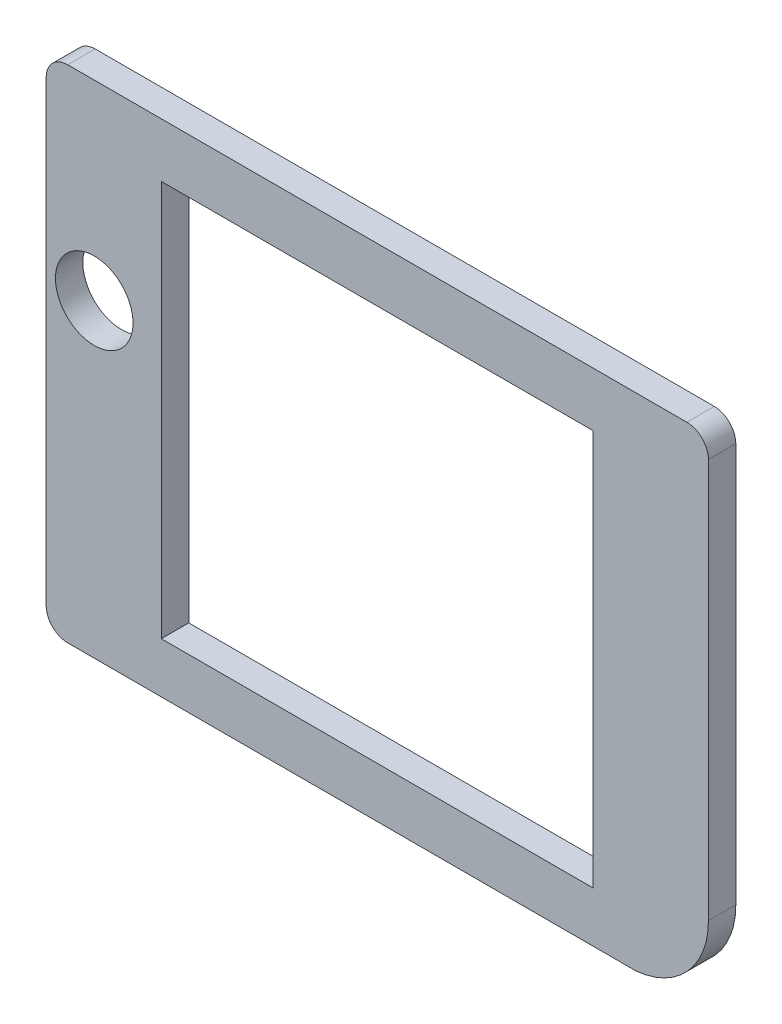
ISO-10303-21;
HEADER;
FILE_DESCRIPTION(('STEP AP214'),'2;1');
FILE_NAME('part.step','',(''),(''),'','','');
FILE_SCHEMA(('AUTOMOTIVE_DESIGN { 1 0 10303 214 1 1 1 1 }'));
ENDSEC;
DATA;
#1=APPLICATION_CONTEXT('core data for automotive mechanical design processes');
#2=APPLICATION_PROTOCOL_DEFINITION('international standard','automotive_design',2000,#1);
#3=PRODUCT_CONTEXT('',#1,'mechanical');
#4=PRODUCT('Part','Part','',(#3));
#5=PRODUCT_RELATED_PRODUCT_CATEGORY('part','',(#4));
#6=PRODUCT_DEFINITION_FORMATION('','',#4);
#7=PRODUCT_DEFINITION_CONTEXT('part definition',#1,'design');
#8=PRODUCT_DEFINITION('design','',#6,#7);
#9=PRODUCT_DEFINITION_SHAPE('','',#8);
#10=(LENGTH_UNIT() NAMED_UNIT(*) SI_UNIT(.MILLI.,.METRE.));
#11=(NAMED_UNIT(*) PLANE_ANGLE_UNIT() SI_UNIT($,.RADIAN.));
#12=(NAMED_UNIT(*) SI_UNIT($,.STERADIAN.) SOLID_ANGLE_UNIT());
#13=UNCERTAINTY_MEASURE_WITH_UNIT(LENGTH_MEASURE(1.E-05),#10,'distance_accuracy_value','');
#14=(GEOMETRIC_REPRESENTATION_CONTEXT(3) GLOBAL_UNCERTAINTY_ASSIGNED_CONTEXT((#13)) GLOBAL_UNIT_ASSIGNED_CONTEXT((#10,
#11,#12)) REPRESENTATION_CONTEXT('',''));
#15=CARTESIAN_POINT('',(0.,0.,0.));
#16=DIRECTION('',(0.,0.,1.));
#17=DIRECTION('',(1.,0.,0.));
#18=AXIS2_PLACEMENT_3D('',#15,#16,#17);
#19=CARTESIAN_POINT('',(0.,4.41801464169069,3.18));
#20=DIRECTION('',(0.,1.,0.));
#21=DIRECTION('',(-1.,0.,0.));
#22=AXIS2_PLACEMENT_3D('',#19,#20,#21);
#23=PLANE('',#22);
#24=DIRECTION('',(1.,0.,0.));
#25=VECTOR('',#24,1.);
#26=CARTESIAN_POINT('',(0.,4.41801464169069,0.));
#27=LINE('',#26,#25);
#28=CARTESIAN_POINT('',(-35.9191511084698,4.41801464169085,0.));
#29=VERTEX_POINT('',#28);
#30=CARTESIAN_POINT('',(29.9973750981675,4.41801464169056,0.));
#31=VERTEX_POINT('',#30);
#32=EDGE_CURVE('E192',#29,#31,#27,.T.);
#33=ORIENTED_EDGE('',*,*,#32,.T.);
#34=DIRECTION('',(0.,0.,-1.));
#35=VECTOR('',#34,1.);
#36=CARTESIAN_POINT('',(29.9973750981675,4.41801464169056,3.18));
#37=LINE('',#36,#35);
#38=CARTESIAN_POINT('',(29.9973750981675,4.41801464169056,3.18));
#39=VERTEX_POINT('',#38);
#40=EDGE_CURVE('E11',#39,#31,#37,.T.);
#41=ORIENTED_EDGE('',*,*,#40,.F.);
#42=DIRECTION('',(1.,0.,0.));
#43=VECTOR('',#42,1.);
#44=CARTESIAN_POINT('',(0.,4.41801464169069,3.18));
#45=LINE('',#44,#43);
#46=CARTESIAN_POINT('',(-35.9191511084698,4.41801464169085,3.18));
#47=VERTEX_POINT('',#46);
#48=EDGE_CURVE('E270',#47,#39,#45,.T.);
#49=ORIENTED_EDGE('',*,*,#48,.F.);
#50=DIRECTION('',(0.,0.,-1.));
#51=VECTOR('',#50,1.);
#52=CARTESIAN_POINT('',(-35.9191511084698,4.41801464169085,3.18));
#53=LINE('',#52,#51);
#54=EDGE_CURVE('E215',#47,#29,#53,.T.);
#55=ORIENTED_EDGE('',*,*,#54,.T.);
#56=EDGE_LOOP('',(#33,#41,#49,#55));
#57=FACE_BOUND('',#56,.T.);
#58=ADVANCED_FACE('F43',(#57),#23,.F.);
#59=CARTESIAN_POINT('',(29.1397284831023,13.6281689446147,3.18));
#60=DIRECTION('',(0.,0.,-1.));
#61=DIRECTION('',(-1.,0.,0.));
#62=AXIS2_PLACEMENT_3D('',#59,#60,#61);
#63=CYLINDRICAL_SURFACE('',#62,9.25000000000015);
#64=CARTESIAN_POINT('',(29.1397284831023,13.6281689446147,0.));
#65=DIRECTION('',(0.,0.,1.));
#66=DIRECTION('',(1.,0.,0.));
#67=AXIS2_PLACEMENT_3D('',#64,#65,#66);
#68=CIRCLE('',#67,9.25000000000015);
#69=CARTESIAN_POINT('',(38.3896426621866,13.6680146416905,0.));
#70=VERTEX_POINT('',#69);
#71=EDGE_CURVE('E196',#31,#70,#68,.T.);
#72=ORIENTED_EDGE('',*,*,#71,.T.);
#73=DIRECTION('',(0.,0.,-1.));
#74=VECTOR('',#73,1.);
#75=CARTESIAN_POINT('',(38.3896426621866,13.6680146416905,3.18));
#76=LINE('',#75,#74);
#77=CARTESIAN_POINT('',(38.3896426621866,13.6680146416905,3.18));
#78=VERTEX_POINT('',#77);
#79=EDGE_CURVE('E54',#78,#70,#76,.T.);
#80=ORIENTED_EDGE('',*,*,#79,.F.);
#81=CARTESIAN_POINT('',(29.1397284831023,13.6281689446147,3.18));
#82=DIRECTION('',(0.,0.,1.));
#83=DIRECTION('',(1.,0.,0.));
#84=AXIS2_PLACEMENT_3D('',#81,#82,#83);
#85=CIRCLE('',#84,9.25000000000015);
#86=EDGE_CURVE('E276',#39,#78,#85,.T.);
#87=ORIENTED_EDGE('',*,*,#86,.F.);
#88=ORIENTED_EDGE('',*,*,#40,.T.);
#89=EDGE_LOOP('',(#72,#80,#87,#88));
#90=FACE_BOUND('',#89,.T.);
#91=ADVANCED_FACE('F314',(#90),#63,.T.);
#92=CARTESIAN_POINT('',(38.3896426621866,0.,3.18));
#93=DIRECTION('',(-1.,0.,0.));
#94=DIRECTION('',(0.,-1.,0.));
#95=AXIS2_PLACEMENT_3D('',#92,#93,#94);
#96=PLANE('',#95);
#97=DIRECTION('',(0.,1.,0.));
#98=VECTOR('',#97,1.);
#99=CARTESIAN_POINT('',(38.3896426621866,0.,0.));
#100=LINE('',#99,#98);
#101=CARTESIAN_POINT('',(38.3896426621865,59.9900774785584,0.));
#102=VERTEX_POINT('',#101);
#103=EDGE_CURVE('E199',#70,#102,#100,.T.);
#104=ORIENTED_EDGE('',*,*,#103,.T.);
#105=DIRECTION('',(0.,0.,-1.));
#106=VECTOR('',#105,1.);
#107=CARTESIAN_POINT('',(38.3896426621865,59.9900774785584,3.18));
#108=LINE('',#107,#106);
#109=CARTESIAN_POINT('',(38.3896426621865,59.9900774785584,3.18));
#110=VERTEX_POINT('',#109);
#111=EDGE_CURVE('E226',#110,#102,#108,.T.);
#112=ORIENTED_EDGE('',*,*,#111,.F.);
#113=DIRECTION('',(0.,1.,0.));
#114=VECTOR('',#113,1.);
#115=CARTESIAN_POINT('',(38.3896426621866,0.,3.18));
#116=LINE('',#115,#114);
#117=EDGE_CURVE('E279',#78,#110,#116,.T.);
#118=ORIENTED_EDGE('',*,*,#117,.F.);
#119=ORIENTED_EDGE('',*,*,#79,.T.);
#120=EDGE_LOOP('',(#104,#112,#118,#119));
#121=FACE_BOUND('',#120,.T.);
#122=ADVANCED_FACE('F319',(#121),#96,.F.);
#123=CARTESIAN_POINT('',(35.8896426621866,59.9900774785584,3.18));
#124=DIRECTION('',(0.,0.,-1.));
#125=DIRECTION('',(-1.,0.,0.));
#126=AXIS2_PLACEMENT_3D('',#123,#124,#125);
#127=CYLINDRICAL_SURFACE('',#126,2.49999999999998);
#128=CARTESIAN_POINT('',(35.8896426621866,59.9900774785584,0.));
#129=DIRECTION('',(0.,0.,1.));
#130=DIRECTION('',(1.,0.,0.));
#131=AXIS2_PLACEMENT_3D('',#128,#129,#130);
#132=CIRCLE('',#131,2.49999999999998);
#133=CARTESIAN_POINT('',(35.8896426621865,62.4900774785584,0.));
#134=VERTEX_POINT('',#133);
#135=EDGE_CURVE('E202',#102,#134,#132,.T.);
#136=ORIENTED_EDGE('',*,*,#135,.T.);
#137=DIRECTION('',(0.,0.,-1.));
#138=VECTOR('',#137,1.);
#139=CARTESIAN_POINT('',(35.8896426621865,62.4900774785584,3.18));
#140=LINE('',#139,#138);
#141=CARTESIAN_POINT('',(35.8896426621865,62.4900774785584,3.18));
#142=VERTEX_POINT('',#141);
#143=EDGE_CURVE('E222',#142,#134,#140,.T.);
#144=ORIENTED_EDGE('',*,*,#143,.F.);
#145=CARTESIAN_POINT('',(35.8896426621866,59.9900774785584,3.18));
#146=DIRECTION('',(0.,0.,1.));
#147=DIRECTION('',(1.,0.,0.));
#148=AXIS2_PLACEMENT_3D('',#145,#146,#147);
#149=CIRCLE('',#148,2.49999999999998);
#150=EDGE_CURVE('E282',#110,#142,#149,.T.);
#151=ORIENTED_EDGE('',*,*,#150,.F.);
#152=ORIENTED_EDGE('',*,*,#111,.T.);
#153=EDGE_LOOP('',(#136,#144,#151,#152));
#154=FACE_BOUND('',#153,.T.);
#155=ADVANCED_FACE('F290',(#154),#127,.T.);
#156=CARTESIAN_POINT('',(0.,62.4900774785584,3.18));
#157=DIRECTION('',(0.,-1.,0.));
#158=DIRECTION('',(1.,0.,0.));
#159=AXIS2_PLACEMENT_3D('',#156,#157,#158);
#160=PLANE('',#159);
#161=DIRECTION('',(-1.,0.,0.));
#162=VECTOR('',#161,1.);
#163=CARTESIAN_POINT('',(0.,62.4900774785584,0.));
#164=LINE('',#163,#162);
#165=CARTESIAN_POINT('',(-35.9191511084698,62.4900774785584,0.));
#166=VERTEX_POINT('',#165);
#167=EDGE_CURVE('E205',#134,#166,#164,.T.);
#168=ORIENTED_EDGE('',*,*,#167,.T.);
#169=DIRECTION('',(0.,0.,-1.));
#170=VECTOR('',#169,1.);
#171=CARTESIAN_POINT('',(-35.9191511084698,62.4900774785584,3.18));
#172=LINE('',#171,#170);
#173=CARTESIAN_POINT('',(-35.9191511084698,62.4900774785584,3.18));
#174=VERTEX_POINT('',#173);
#175=EDGE_CURVE('E161',#174,#166,#172,.T.);
#176=ORIENTED_EDGE('',*,*,#175,.F.);
#177=DIRECTION('',(-1.,0.,0.));
#178=VECTOR('',#177,1.);
#179=CARTESIAN_POINT('',(0.,62.4900774785584,3.18));
#180=LINE('',#179,#178);
#181=EDGE_CURVE('E150',#142,#174,#180,.T.);
#182=ORIENTED_EDGE('',*,*,#181,.F.);
#183=ORIENTED_EDGE('',*,*,#143,.T.);
#184=EDGE_LOOP('',(#168,#176,#182,#183));
#185=FACE_BOUND('',#184,.T.);
#186=ADVANCED_FACE('F294',(#185),#160,.F.);
#187=CARTESIAN_POINT('',(-35.9191511084698,59.9900774785584,3.18));
#188=DIRECTION('',(0.,0.,-1.));
#189=DIRECTION('',(-1.,0.,0.));
#190=AXIS2_PLACEMENT_3D('',#187,#188,#189);
#191=CYLINDRICAL_SURFACE('',#190,2.5);
#192=CARTESIAN_POINT('',(-35.9191511084698,59.9900774785584,0.));
#193=DIRECTION('',(0.,0.,1.));
#194=DIRECTION('',(1.,0.,0.));
#195=AXIS2_PLACEMENT_3D('',#192,#193,#194);
#196=CIRCLE('',#195,2.5);
#197=CARTESIAN_POINT('',(-38.4191511084698,59.9900774785584,0.));
#198=VERTEX_POINT('',#197);
#199=EDGE_CURVE('E159',#166,#198,#196,.T.);
#200=ORIENTED_EDGE('',*,*,#199,.T.);
#201=DIRECTION('',(0.,0.,-1.));
#202=VECTOR('',#201,1.);
#203=CARTESIAN_POINT('',(-38.4191511084698,59.9900774785584,3.18));
#204=LINE('',#203,#202);
#205=CARTESIAN_POINT('',(-38.4191511084698,59.9900774785584,3.18));
#206=VERTEX_POINT('',#205);
#207=EDGE_CURVE('E156',#206,#198,#204,.T.);
#208=ORIENTED_EDGE('',*,*,#207,.F.);
#209=CARTESIAN_POINT('',(-35.9191511084698,59.9900774785584,3.18));
#210=DIRECTION('',(0.,0.,1.));
#211=DIRECTION('',(1.,0.,0.));
#212=AXIS2_PLACEMENT_3D('',#209,#210,#211);
#213=CIRCLE('',#212,2.5);
#214=EDGE_CURVE('E144',#174,#206,#213,.T.);
#215=ORIENTED_EDGE('',*,*,#214,.F.);
#216=ORIENTED_EDGE('',*,*,#175,.T.);
#217=EDGE_LOOP('',(#200,#208,#215,#216));
#218=FACE_BOUND('',#217,.T.);
#219=ADVANCED_FACE('F157',(#218),#191,.T.);
#220=CARTESIAN_POINT('',(-38.4191511084698,0.,3.18));
#221=DIRECTION('',(1.,0.,0.));
#222=DIRECTION('',(0.,1.,0.));
#223=AXIS2_PLACEMENT_3D('',#220,#221,#222);
#224=PLANE('',#223);
#225=DIRECTION('',(0.,-1.,0.));
#226=VECTOR('',#225,1.);
#227=CARTESIAN_POINT('',(-38.4191511084698,0.,0.));
#228=LINE('',#227,#226);
#229=CARTESIAN_POINT('',(-38.4191511084698,6.91801464169087,0.));
#230=VERTEX_POINT('',#229);
#231=EDGE_CURVE('E104',#198,#230,#228,.T.);
#232=ORIENTED_EDGE('',*,*,#231,.T.);
#233=DIRECTION('',(0.,0.,-1.));
#234=VECTOR('',#233,1.);
#235=CARTESIAN_POINT('',(-38.4191511084698,6.91801464169087,3.18));
#236=LINE('',#235,#234);
#237=CARTESIAN_POINT('',(-38.4191511084698,6.91801464169087,3.18));
#238=VERTEX_POINT('',#237);
#239=EDGE_CURVE('E162',#238,#230,#236,.T.);
#240=ORIENTED_EDGE('',*,*,#239,.F.);
#241=DIRECTION('',(0.,-1.,0.));
#242=VECTOR('',#241,1.);
#243=CARTESIAN_POINT('',(-38.4191511084698,0.,3.18));
#244=LINE('',#243,#242);
#245=EDGE_CURVE('E148',#206,#238,#244,.T.);
#246=ORIENTED_EDGE('',*,*,#245,.F.);
#247=ORIENTED_EDGE('',*,*,#207,.T.);
#248=EDGE_LOOP('',(#232,#240,#246,#247));
#249=FACE_BOUND('',#248,.T.);
#250=ADVANCED_FACE('F164',(#249),#224,.F.);
#251=CARTESIAN_POINT('',(0.,56.2000774785584,3.18));
#252=DIRECTION('',(0.,-1.,0.));
#253=DIRECTION('',(1.,0.,0.));
#254=AXIS2_PLACEMENT_3D('',#251,#252,#253);
#255=PLANE('',#254);
#256=DIRECTION('',(-1.,0.,0.));
#257=VECTOR('',#256,1.);
#258=CARTESIAN_POINT('',(0.,56.2000774785584,0.));
#259=LINE('',#258,#257);
#260=CARTESIAN_POINT('',(25.0302948956482,56.2000774785584,0.));
#261=VERTEX_POINT('',#260);
#262=CARTESIAN_POINT('',(-25.0598033419313,56.2000774785584,0.));
#263=VERTEX_POINT('',#262);
#264=EDGE_CURVE('E172',#261,#263,#259,.T.);
#265=ORIENTED_EDGE('',*,*,#264,.F.);
#266=DIRECTION('',(0.,0.,-1.));
#267=VECTOR('',#266,1.);
#268=CARTESIAN_POINT('',(25.0302948956482,56.2000774785584,3.18));
#269=LINE('',#268,#267);
#270=CARTESIAN_POINT('',(25.0302948956482,56.2000774785584,3.18));
#271=VERTEX_POINT('',#270);
#272=EDGE_CURVE('E47',#271,#261,#269,.T.);
#273=ORIENTED_EDGE('',*,*,#272,.F.);
#274=DIRECTION('',(-1.,0.,0.));
#275=VECTOR('',#274,1.);
#276=CARTESIAN_POINT('',(0.,56.2000774785584,3.18));
#277=LINE('',#276,#275);
#278=CARTESIAN_POINT('',(-25.0598033419313,56.2000774785584,3.18));
#279=VERTEX_POINT('',#278);
#280=EDGE_CURVE('E214',#271,#279,#277,.T.);
#281=ORIENTED_EDGE('',*,*,#280,.T.);
#282=DIRECTION('',(0.,0.,-1.));
#283=VECTOR('',#282,1.);
#284=CARTESIAN_POINT('',(-25.0598033419313,56.2000774785584,3.18));
#285=LINE('',#284,#283);
#286=EDGE_CURVE('E168',#279,#263,#285,.T.);
#287=ORIENTED_EDGE('',*,*,#286,.T.);
#288=EDGE_LOOP('',(#265,#273,#281,#287));
#289=FACE_BOUND('',#288,.T.);
#290=ADVANCED_FACE('F45',(#289),#255,.T.);
#291=CARTESIAN_POINT('',(25.0302948956483,0.,3.18));
#292=DIRECTION('',(-1.,0.,0.));
#293=DIRECTION('',(0.,-1.,0.));
#294=AXIS2_PLACEMENT_3D('',#291,#292,#293);
#295=PLANE('',#294);
#296=DIRECTION('',(0.,1.,0.));
#297=VECTOR('',#296,1.);
#298=CARTESIAN_POINT('',(25.0302948956483,0.,0.));
#299=LINE('',#298,#297);
#300=CARTESIAN_POINT('',(25.0302948956483,10.2680146416908,0.));
#301=VERTEX_POINT('',#300);
#302=EDGE_CURVE('E176',#301,#261,#299,.T.);
#303=ORIENTED_EDGE('',*,*,#302,.F.);
#304=DIRECTION('',(0.,0.,-1.));
#305=VECTOR('',#304,1.);
#306=CARTESIAN_POINT('',(25.0302948956483,10.2680146416908,3.18));
#307=LINE('',#306,#305);
#308=CARTESIAN_POINT('',(25.0302948956483,10.2680146416908,3.18));
#309=VERTEX_POINT('',#308);
#310=EDGE_CURVE('E237',#309,#301,#307,.T.);
#311=ORIENTED_EDGE('',*,*,#310,.F.);
#312=DIRECTION('',(0.,1.,0.));
#313=VECTOR('',#312,1.);
#314=CARTESIAN_POINT('',(25.0302948956483,0.,3.18));
#315=LINE('',#314,#313);
#316=EDGE_CURVE('E248',#309,#271,#315,.T.);
#317=ORIENTED_EDGE('',*,*,#316,.T.);
#318=ORIENTED_EDGE('',*,*,#272,.T.);
#319=EDGE_LOOP('',(#303,#311,#317,#318));
#320=FACE_BOUND('',#319,.T.);
#321=ADVANCED_FACE('F246',(#320),#295,.T.);
#322=CARTESIAN_POINT('',(0.,10.2680146416908,3.18));
#323=DIRECTION('',(0.,1.,0.));
#324=DIRECTION('',(-1.,0.,0.));
#325=AXIS2_PLACEMENT_3D('',#322,#323,#324);
#326=PLANE('',#325);
#327=DIRECTION('',(1.,0.,0.));
#328=VECTOR('',#327,1.);
#329=CARTESIAN_POINT('',(0.,10.2680146416908,0.));
#330=LINE('',#329,#328);
#331=CARTESIAN_POINT('',(-25.0598033419315,10.2680146416908,0.));
#332=VERTEX_POINT('',#331);
#333=EDGE_CURVE('E180',#332,#301,#330,.T.);
#334=ORIENTED_EDGE('',*,*,#333,.F.);
#335=DIRECTION('',(0.,0.,-1.));
#336=VECTOR('',#335,1.);
#337=CARTESIAN_POINT('',(-25.0598033419315,10.2680146416908,3.18));
#338=LINE('',#337,#336);
#339=CARTESIAN_POINT('',(-25.0598033419315,10.2680146416908,3.18));
#340=VERTEX_POINT('',#339);
#341=EDGE_CURVE('E235',#340,#332,#338,.T.);
#342=ORIENTED_EDGE('',*,*,#341,.F.);
#343=DIRECTION('',(1.,0.,0.));
#344=VECTOR('',#343,1.);
#345=CARTESIAN_POINT('',(0.,10.2680146416908,3.18));
#346=LINE('',#345,#344);
#347=EDGE_CURVE('E255',#340,#309,#346,.T.);
#348=ORIENTED_EDGE('',*,*,#347,.T.);
#349=ORIENTED_EDGE('',*,*,#310,.T.);
#350=EDGE_LOOP('',(#334,#342,#348,#349));
#351=FACE_BOUND('',#350,.T.);
#352=ADVANCED_FACE('F253',(#351),#326,.T.);
#353=CARTESIAN_POINT('',(-32.8458653670227,40.325993685381,3.18));
#354=DIRECTION('',(0.,0.,-1.));
#355=DIRECTION('',(-1.,0.,0.));
#356=AXIS2_PLACEMENT_3D('',#353,#354,#355);
#357=CYLINDRICAL_SURFACE('',#356,4.49999999999987);
#358=CARTESIAN_POINT('',(-32.8458653670227,40.325993685381,3.18));
#359=DIRECTION('',(0.,0.,1.));
#360=DIRECTION('',(1.,0.,0.));
#361=AXIS2_PLACEMENT_3D('',#358,#359,#360);
#362=CIRCLE('',#361,4.49999999999987);
#363=CARTESIAN_POINT('',(-37.3458653670226,40.325993685381,3.18));
#364=VERTEX_POINT('',#363);
#365=EDGE_CURVE('E266',#364,#364,#362,.T.);
#366=CARTESIAN_POINT('',(-32.8458653670227,40.325993685381,0.));
#367=DIRECTION('',(0.,0.,1.));
#368=DIRECTION('',(1.,0.,0.));
#369=AXIS2_PLACEMENT_3D('',#366,#367,#368);
#370=CIRCLE('',#369,4.49999999999987);
#371=CARTESIAN_POINT('',(-37.3458653670226,40.325993685381,0.));
#372=VERTEX_POINT('',#371);
#373=EDGE_CURVE('E188',#372,#372,#370,.T.);
#374=CARTESIAN_POINT('',(-37.3458653670226,40.325993685381,3.18));
#375=CARTESIAN_POINT('',(-37.3458653670226,40.325993685381,3.146875));
#376=CARTESIAN_POINT('',(-37.3458653670226,40.325993685381,3.11375));
#377=CARTESIAN_POINT('',(-37.3458653670226,40.325993685381,3.0475));
#378=CARTESIAN_POINT('',(-37.3458653670226,40.325993685381,3.014375));
#379=CARTESIAN_POINT('',(-37.3458653670226,40.325993685381,2.948125));
#380=CARTESIAN_POINT('',(-37.3458653670226,40.325993685381,2.915));
#381=CARTESIAN_POINT('',(-37.3458653670226,40.325993685381,2.84875));
#382=CARTESIAN_POINT('',(-37.3458653670226,40.325993685381,2.815625));
#383=CARTESIAN_POINT('',(-37.3458653670226,40.325993685381,2.749375));
#384=CARTESIAN_POINT('',(-37.3458653670226,40.325993685381,2.71625));
#385=CARTESIAN_POINT('',(-37.3458653670226,40.325993685381,2.65));
#386=CARTESIAN_POINT('',(-37.3458653670226,40.325993685381,2.616875));
#387=CARTESIAN_POINT('',(-37.3458653670226,40.325993685381,2.550625));
#388=CARTESIAN_POINT('',(-37.3458653670226,40.325993685381,2.5175));
#389=CARTESIAN_POINT('',(-37.3458653670226,40.325993685381,2.45125));
#390=CARTESIAN_POINT('',(-37.3458653670226,40.325993685381,2.418125));
#391=CARTESIAN_POINT('',(-37.3458653670226,40.325993685381,2.351875));
#392=CARTESIAN_POINT('',(-37.3458653670226,40.325993685381,2.31875));
#393=CARTESIAN_POINT('',(-37.3458653670226,40.325993685381,2.2525));
#394=CARTESIAN_POINT('',(-37.3458653670226,40.325993685381,2.219375));
#395=CARTESIAN_POINT('',(-37.3458653670226,40.325993685381,2.153125));
#396=CARTESIAN_POINT('',(-37.3458653670226,40.325993685381,2.12));
#397=CARTESIAN_POINT('',(-37.3458653670226,40.325993685381,2.05375));
#398=CARTESIAN_POINT('',(-37.3458653670226,40.325993685381,2.020625));
#399=CARTESIAN_POINT('',(-37.3458653670226,40.325993685381,1.954375));
#400=CARTESIAN_POINT('',(-37.3458653670226,40.325993685381,1.92125));
#401=CARTESIAN_POINT('',(-37.3458653670226,40.325993685381,1.855));
#402=CARTESIAN_POINT('',(-37.3458653670226,40.325993685381,1.821875));
#403=CARTESIAN_POINT('',(-37.3458653670226,40.325993685381,1.755625));
#404=CARTESIAN_POINT('',(-37.3458653670226,40.325993685381,1.7225));
#405=CARTESIAN_POINT('',(-37.3458653670226,40.325993685381,1.65625));
#406=CARTESIAN_POINT('',(-37.3458653670226,40.325993685381,1.623125));
#407=CARTESIAN_POINT('',(-37.3458653670226,40.325993685381,1.556875));
#408=CARTESIAN_POINT('',(-37.3458653670226,40.325993685381,1.52375));
#409=CARTESIAN_POINT('',(-37.3458653670226,40.325993685381,1.4575));
#410=CARTESIAN_POINT('',(-37.3458653670226,40.325993685381,1.424375));
#411=CARTESIAN_POINT('',(-37.3458653670226,40.325993685381,1.358125));
#412=CARTESIAN_POINT('',(-37.3458653670226,40.325993685381,1.325));
#413=CARTESIAN_POINT('',(-37.3458653670226,40.325993685381,1.25875));
#414=CARTESIAN_POINT('',(-37.3458653670226,40.325993685381,1.225625));
#415=CARTESIAN_POINT('',(-37.3458653670226,40.325993685381,1.159375));
#416=CARTESIAN_POINT('',(-37.3458653670226,40.325993685381,1.12625));
#417=CARTESIAN_POINT('',(-37.3458653670226,40.325993685381,1.06));
#418=CARTESIAN_POINT('',(-37.3458653670226,40.325993685381,1.026875));
#419=CARTESIAN_POINT('',(-37.3458653670226,40.325993685381,0.960625));
#420=CARTESIAN_POINT('',(-37.3458653670226,40.325993685381,0.9275));
#421=CARTESIAN_POINT('',(-37.3458653670226,40.325993685381,0.86125));
#422=CARTESIAN_POINT('',(-37.3458653670226,40.325993685381,0.828125));
#423=CARTESIAN_POINT('',(-37.3458653670226,40.325993685381,0.761875));
#424=CARTESIAN_POINT('',(-37.3458653670226,40.325993685381,0.72875));
#425=CARTESIAN_POINT('',(-37.3458653670226,40.325993685381,0.6625));
#426=CARTESIAN_POINT('',(-37.3458653670226,40.325993685381,0.629375));
#427=CARTESIAN_POINT('',(-37.3458653670226,40.325993685381,0.563125));
#428=CARTESIAN_POINT('',(-37.3458653670226,40.325993685381,0.53));
#429=CARTESIAN_POINT('',(-37.3458653670226,40.325993685381,0.46375));
#430=CARTESIAN_POINT('',(-37.3458653670226,40.325993685381,0.430625));
#431=CARTESIAN_POINT('',(-37.3458653670226,40.325993685381,0.364375));
#432=CARTESIAN_POINT('',(-37.3458653670226,40.325993685381,0.33125));
#433=CARTESIAN_POINT('',(-37.3458653670226,40.325993685381,0.265));
#434=CARTESIAN_POINT('',(-37.3458653670226,40.325993685381,0.231875));
#435=CARTESIAN_POINT('',(-37.3458653670226,40.325993685381,0.165625));
#436=CARTESIAN_POINT('',(-37.3458653670226,40.325993685381,0.1325));
#437=CARTESIAN_POINT('',(-37.3458653670226,40.325993685381,0.06625));
#438=CARTESIAN_POINT('',(-37.3458653670226,40.325993685381,0.033125));
#439=CARTESIAN_POINT('',(-37.3458653670226,40.325993685381,0.));
#440=B_SPLINE_CURVE_WITH_KNOTS('',3,(#374,#375,#376,#377,#378,#379,#380,#381,#382,#383,#384,
#385,#386,#387,#388,#389,#390,#391,#392,#393,#394,#395,#396,#397,#398,#399,#400,#401,#402,#403,
#404,#405,#406,#407,#408,#409,#410,#411,#412,#413,#414,#415,#416,#417,#418,#419,#420,#421,#422,
#423,#424,#425,#426,#427,#428,#429,#430,#431,#432,#433,#434,#435,#436,#437,#438,#439),
.UNSPECIFIED.,.F.,.F.,(4,2,2,2,2,2,2,2,2,2,2,2,2,2,2,2,2,2,2,2,2,2,2,2,2,2,2,2,2,2,2,2,4),(0.,
0.0993750000000001,0.19875,0.298125,0.3975,0.496875,0.59625,0.695625,0.795,0.894375,0.99375,
1.093125,1.1925,1.291875,1.39125,1.490625,1.59,1.689375,1.78875,1.888125,1.9875,2.086875,
2.18625,2.285625,2.385,2.484375,2.58375,2.683125,2.7825,2.881875,2.98125,3.080625,3.18),.UNSPECIFIED.);
#441=EDGE_CURVE('BSEAM309',#364,#372,#440,.T.);
#442=ORIENTED_EDGE('',*,*,#365,.T.);
#443=ORIENTED_EDGE('',*,*,#373,.F.);
#444=ORIENTED_EDGE('',*,*,#441,.T.);
#445=ORIENTED_EDGE('',*,*,#441,.F.);
#446=EDGE_LOOP('',(#442,#444,#443,#445));
#447=FACE_BOUND('',#446,.T.);
#448=ADVANCED_FACE('F309',(#447),#357,.F.);
#449=CARTESIAN_POINT('',(-25.0598033419315,1.13572506373176E-13,3.18));
#450=DIRECTION('',(1.,0.,0.));
#451=DIRECTION('',(0.,1.,0.));
#452=AXIS2_PLACEMENT_3D('',#449,#450,#451);
#453=PLANE('',#452);
#454=DIRECTION('',(0.,-1.,0.));
#455=VECTOR('',#454,1.);
#456=CARTESIAN_POINT('',(-25.0598033419315,1.13572506373176E-13,0.));
#457=LINE('',#456,#455);
#458=EDGE_CURVE('E184',#263,#332,#457,.T.);
#459=ORIENTED_EDGE('',*,*,#458,.F.);
#460=ORIENTED_EDGE('',*,*,#286,.F.);
#461=DIRECTION('',(0.,-1.,0.));
#462=VECTOR('',#461,1.);
#463=CARTESIAN_POINT('',(-25.0598033419315,1.13572506373176E-13,3.18));
#464=LINE('',#463,#462);
#465=EDGE_CURVE('E261',#279,#340,#464,.T.);
#466=ORIENTED_EDGE('',*,*,#465,.T.);
#467=ORIENTED_EDGE('',*,*,#341,.T.);
#468=EDGE_LOOP('',(#459,#460,#466,#467));
#469=FACE_BOUND('',#468,.T.);
#470=ADVANCED_FACE('F264',(#469),#453,.T.);
#471=CARTESIAN_POINT('',(-35.9191511084698,6.91801464169085,3.18));
#472=DIRECTION('',(0.,0.,-1.));
#473=DIRECTION('',(-1.,0.,0.));
#474=AXIS2_PLACEMENT_3D('',#471,#472,#473);
#475=CYLINDRICAL_SURFACE('',#474,2.5);
#476=CARTESIAN_POINT('',(-35.9191511084698,6.91801464169085,0.));
#477=DIRECTION('',(0.,0.,1.));
#478=DIRECTION('',(1.,0.,0.));
#479=AXIS2_PLACEMENT_3D('',#476,#477,#478);
#480=CIRCLE('',#479,2.5);
#481=EDGE_CURVE('E110',#230,#29,#480,.T.);
#482=ORIENTED_EDGE('',*,*,#481,.T.);
#483=ORIENTED_EDGE('',*,*,#54,.F.);
#484=CARTESIAN_POINT('',(-35.9191511084698,6.91801464169085,3.18));
#485=DIRECTION('',(0.,0.,1.));
#486=DIRECTION('',(1.,0.,0.));
#487=AXIS2_PLACEMENT_3D('',#484,#485,#486);
#488=CIRCLE('',#487,2.5);
#489=EDGE_CURVE('E63',#238,#47,#488,.T.);
#490=ORIENTED_EDGE('',*,*,#489,.F.);
#491=ORIENTED_EDGE('',*,*,#239,.T.);
#492=EDGE_LOOP('',(#482,#483,#490,#491));
#493=FACE_BOUND('',#492,.T.);
#494=ADVANCED_FACE('F301',(#493),#475,.T.);
#495=CARTESIAN_POINT('',(0.,0.,3.18));
#496=DIRECTION('',(0.,0.,1.));
#497=DIRECTION('',(1.,0.,0.));
#498=AXIS2_PLACEMENT_3D('',#495,#496,#497);
#499=PLANE('',#498);
#500=ORIENTED_EDGE('',*,*,#280,.F.);
#501=ORIENTED_EDGE('',*,*,#316,.F.);
#502=ORIENTED_EDGE('',*,*,#347,.F.);
#503=ORIENTED_EDGE('',*,*,#465,.F.);
#504=EDGE_LOOP('',(#500,#501,#502,#503));
#505=FACE_BOUND('',#504,.T.);
#506=ORIENTED_EDGE('',*,*,#365,.F.);
#507=EDGE_LOOP('',(#506));
#508=FACE_BOUND('',#507,.T.);
#509=ORIENTED_EDGE('',*,*,#48,.T.);
#510=ORIENTED_EDGE('',*,*,#86,.T.);
#511=ORIENTED_EDGE('',*,*,#117,.T.);
#512=ORIENTED_EDGE('',*,*,#150,.T.);
#513=ORIENTED_EDGE('',*,*,#181,.T.);
#514=ORIENTED_EDGE('',*,*,#214,.T.);
#515=ORIENTED_EDGE('',*,*,#245,.T.);
#516=ORIENTED_EDGE('',*,*,#489,.T.);
#517=EDGE_LOOP('',(#509,#510,#511,#512,#513,#514,#515,#516));
#518=FACE_BOUND('',#517,.T.);
#519=ADVANCED_FACE('F146',(#505,#508,#518),#499,.T.);
#520=CARTESIAN_POINT('',(0.,0.,0.));
#521=DIRECTION('',(0.,0.,1.));
#522=DIRECTION('',(1.,0.,0.));
#523=AXIS2_PLACEMENT_3D('',#520,#521,#522);
#524=PLANE('',#523);
#525=ORIENTED_EDGE('',*,*,#264,.T.);
#526=ORIENTED_EDGE('',*,*,#458,.T.);
#527=ORIENTED_EDGE('',*,*,#333,.T.);
#528=ORIENTED_EDGE('',*,*,#302,.T.);
#529=EDGE_LOOP('',(#525,#526,#527,#528));
#530=FACE_BOUND('',#529,.T.);
#531=ORIENTED_EDGE('',*,*,#373,.T.);
#532=EDGE_LOOP('',(#531));
#533=FACE_BOUND('',#532,.T.);
#534=ORIENTED_EDGE('',*,*,#32,.F.);
#535=ORIENTED_EDGE('',*,*,#481,.F.);
#536=ORIENTED_EDGE('',*,*,#231,.F.);
#537=ORIENTED_EDGE('',*,*,#199,.F.);
#538=ORIENTED_EDGE('',*,*,#167,.F.);
#539=ORIENTED_EDGE('',*,*,#135,.F.);
#540=ORIENTED_EDGE('',*,*,#103,.F.);
#541=ORIENTED_EDGE('',*,*,#71,.F.);
#542=EDGE_LOOP('',(#534,#535,#536,#537,#538,#539,#540,#541));
#543=FACE_BOUND('',#542,.T.);
#544=ADVANCED_FACE('F251',(#530,#533,#543),#524,.F.);
#545=CLOSED_SHELL('',(#58,#91,#122,#155,#186,#219,#250,#290,#321,#352,#448,#470,#494,#519,#544));
#546=MANIFOLD_SOLID_BREP('B2',#545);
#547=ADVANCED_BREP_SHAPE_REPRESENTATION('',(#18,#546),#14);
#548=SHAPE_DEFINITION_REPRESENTATION(#9,#547);
ENDSEC;
END-ISO-10303-21;
